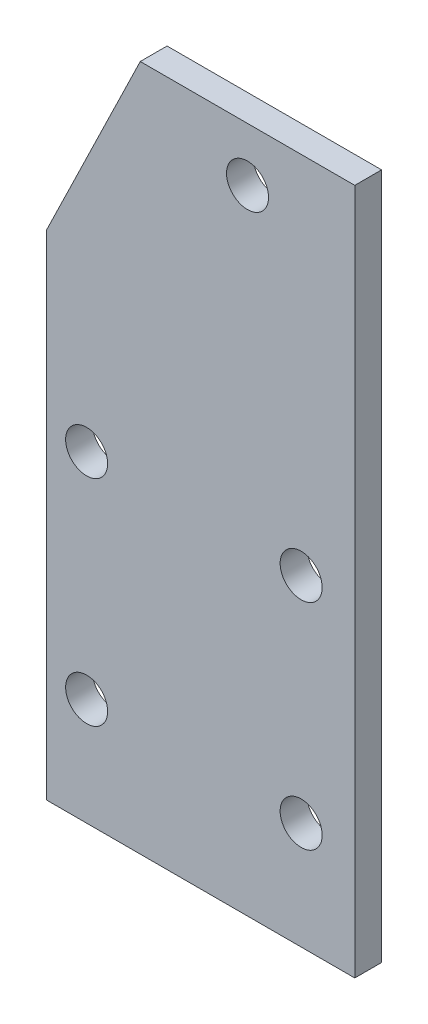
ISO-10303-21;
HEADER;
FILE_DESCRIPTION(('STEP AP214'),'2;1');
FILE_NAME('part.step','',(''),(''),'','','');
FILE_SCHEMA(('AUTOMOTIVE_DESIGN { 1 0 10303 214 1 1 1 1 }'));
ENDSEC;
DATA;
#1=APPLICATION_CONTEXT('core data for automotive mechanical design processes');
#2=APPLICATION_PROTOCOL_DEFINITION('international standard','automotive_design',2000,#1);
#3=PRODUCT_CONTEXT('',#1,'mechanical');
#4=PRODUCT('Part','Part','',(#3));
#5=PRODUCT_RELATED_PRODUCT_CATEGORY('part','',(#4));
#6=PRODUCT_DEFINITION_FORMATION('','',#4);
#7=PRODUCT_DEFINITION_CONTEXT('part definition',#1,'design');
#8=PRODUCT_DEFINITION('design','',#6,#7);
#9=PRODUCT_DEFINITION_SHAPE('','',#8);
#10=(LENGTH_UNIT() NAMED_UNIT(*) SI_UNIT(.MILLI.,.METRE.));
#11=(NAMED_UNIT(*) PLANE_ANGLE_UNIT() SI_UNIT($,.RADIAN.));
#12=(NAMED_UNIT(*) SI_UNIT($,.STERADIAN.) SOLID_ANGLE_UNIT());
#13=UNCERTAINTY_MEASURE_WITH_UNIT(LENGTH_MEASURE(1.E-05),#10,'distance_accuracy_value','');
#14=(GEOMETRIC_REPRESENTATION_CONTEXT(3) GLOBAL_UNCERTAINTY_ASSIGNED_CONTEXT((#13)) GLOBAL_UNIT_ASSIGNED_CONTEXT((#10,
#11,#12)) REPRESENTATION_CONTEXT('',''));
#15=CARTESIAN_POINT('',(0.,0.,0.));
#16=DIRECTION('',(0.,0.,1.));
#17=DIRECTION('',(1.,0.,0.));
#18=AXIS2_PLACEMENT_3D('',#15,#16,#17);
#19=CARTESIAN_POINT('',(0.,0.,3.175));
#20=DIRECTION('',(0.,0.,1.));
#21=DIRECTION('',(1.,0.,0.));
#22=AXIS2_PLACEMENT_3D('',#19,#20,#21);
#23=PLANE('',#22);
#24=CARTESIAN_POINT('',(12.7,-12.7,3.175));
#25=DIRECTION('',(0.,0.,1.));
#26=DIRECTION('',(1.,0.,0.));
#27=AXIS2_PLACEMENT_3D('',#24,#25,#26);
#28=CIRCLE('',#27,2.4892);
#29=CARTESIAN_POINT('',(15.1892,-12.7,3.175));
#30=VERTEX_POINT('',#29);
#31=EDGE_CURVE('E203',#30,#30,#28,.T.);
#32=ORIENTED_EDGE('',*,*,#31,.F.);
#33=EDGE_LOOP('',(#32));
#34=FACE_BOUND('',#33,.T.);
#35=CARTESIAN_POINT('',(-12.7,-12.7,3.175));
#36=DIRECTION('',(0.,0.,1.));
#37=DIRECTION('',(1.,0.,0.));
#38=AXIS2_PLACEMENT_3D('',#35,#36,#37);
#39=CIRCLE('',#38,2.4892);
#40=CARTESIAN_POINT('',(-10.2108,-12.7,3.175));
#41=VERTEX_POINT('',#40);
#42=EDGE_CURVE('E219',#41,#41,#39,.T.);
#43=ORIENTED_EDGE('',*,*,#42,.F.);
#44=EDGE_LOOP('',(#43));
#45=FACE_BOUND('',#44,.T.);
#46=DIRECTION('',(-0.437192706872766,-0.899367854138263,0.));
#47=VECTOR('',#46,1.);
#48=CARTESIAN_POINT('',(-6.35000000000001,55.88,3.175));
#49=LINE('',#48,#47);
#50=CARTESIAN_POINT('',(-6.35000000000001,55.88,3.175));
#51=VERTEX_POINT('',#50);
#52=CARTESIAN_POINT('',(-17.4625,33.02,3.175));
#53=VERTEX_POINT('',#52);
#54=EDGE_CURVE('E139',#51,#53,#49,.T.);
#55=ORIENTED_EDGE('',*,*,#54,.T.);
#56=DIRECTION('',(0.,-1.,0.));
#57=VECTOR('',#56,1.);
#58=CARTESIAN_POINT('',(-17.4625,33.02,3.175));
#59=LINE('',#58,#57);
#60=CARTESIAN_POINT('',(-17.4625,-25.4,3.175));
#61=VERTEX_POINT('',#60);
#62=EDGE_CURVE('E96',#53,#61,#59,.T.);
#63=ORIENTED_EDGE('',*,*,#62,.T.);
#64=DIRECTION('',(1.,0.,0.));
#65=VECTOR('',#64,1.);
#66=CARTESIAN_POINT('',(-17.4625,-25.4,3.175));
#67=LINE('',#66,#65);
#68=CARTESIAN_POINT('',(19.05,-25.4,3.175));
#69=VERTEX_POINT('',#68);
#70=EDGE_CURVE('E100',#61,#69,#67,.T.);
#71=ORIENTED_EDGE('',*,*,#70,.T.);
#72=DIRECTION('',(0.,1.,0.));
#73=VECTOR('',#72,1.);
#74=CARTESIAN_POINT('',(19.05,33.02,3.175));
#75=LINE('',#74,#73);
#76=CARTESIAN_POINT('',(19.05,55.88,3.175));
#77=VERTEX_POINT('',#76);
#78=EDGE_CURVE('E104',#69,#77,#75,.T.);
#79=ORIENTED_EDGE('',*,*,#78,.T.);
#80=DIRECTION('',(-1.,0.,0.));
#81=VECTOR('',#80,1.);
#82=CARTESIAN_POINT('',(19.05,55.88,3.175));
#83=LINE('',#82,#81);
#84=EDGE_CURVE('E63',#77,#51,#83,.T.);
#85=ORIENTED_EDGE('',*,*,#84,.T.);
#86=EDGE_LOOP('',(#55,#63,#71,#79,#85));
#87=FACE_BOUND('',#86,.T.);
#88=CARTESIAN_POINT('',(-12.7,12.7,3.175));
#89=DIRECTION('',(0.,0.,1.));
#90=DIRECTION('',(1.,0.,0.));
#91=AXIS2_PLACEMENT_3D('',#88,#89,#90);
#92=CIRCLE('',#91,2.4892);
#93=CARTESIAN_POINT('',(-10.2108,12.7,3.175));
#94=VERTEX_POINT('',#93);
#95=EDGE_CURVE('E130',#94,#94,#92,.T.);
#96=ORIENTED_EDGE('',*,*,#95,.F.);
#97=EDGE_LOOP('',(#96));
#98=FACE_BOUND('',#97,.T.);
#99=CARTESIAN_POINT('',(12.7,12.7,3.175));
#100=DIRECTION('',(0.,0.,1.));
#101=DIRECTION('',(1.,0.,0.));
#102=AXIS2_PLACEMENT_3D('',#99,#100,#101);
#103=CIRCLE('',#102,2.4892);
#104=CARTESIAN_POINT('',(15.1892,12.7,3.175));
#105=VERTEX_POINT('',#104);
#106=EDGE_CURVE('E211',#105,#105,#103,.T.);
#107=ORIENTED_EDGE('',*,*,#106,.F.);
#108=EDGE_LOOP('',(#107));
#109=FACE_BOUND('',#108,.T.);
#110=CARTESIAN_POINT('',(6.34999999999999,49.53,3.175));
#111=DIRECTION('',(0.,0.,1.));
#112=DIRECTION('',(1.,0.,0.));
#113=AXIS2_PLACEMENT_3D('',#110,#111,#112);
#114=CIRCLE('',#113,2.4892);
#115=CARTESIAN_POINT('',(8.83919999999999,49.53,3.175));
#116=VERTEX_POINT('',#115);
#117=EDGE_CURVE('E192',#116,#116,#114,.T.);
#118=ORIENTED_EDGE('',*,*,#117,.F.);
#119=EDGE_LOOP('',(#118));
#120=FACE_BOUND('',#119,.T.);
#121=ADVANCED_FACE('F45',(#34,#45,#87,#98,#109,#120),#23,.T.);
#122=CARTESIAN_POINT('',(0.,0.,0.));
#123=DIRECTION('',(0.,0.,1.));
#124=DIRECTION('',(1.,0.,0.));
#125=AXIS2_PLACEMENT_3D('',#122,#123,#124);
#126=PLANE('',#125);
#127=DIRECTION('',(-0.437192706872766,-0.899367854138263,0.));
#128=VECTOR('',#127,1.);
#129=CARTESIAN_POINT('',(-6.35000000000001,55.88,0.));
#130=LINE('',#129,#128);
#131=CARTESIAN_POINT('',(-6.35000000000001,55.88,0.));
#132=VERTEX_POINT('',#131);
#133=CARTESIAN_POINT('',(-17.4625,33.02,0.));
#134=VERTEX_POINT('',#133);
#135=EDGE_CURVE('E125',#132,#134,#130,.T.);
#136=ORIENTED_EDGE('',*,*,#135,.F.);
#137=DIRECTION('',(-1.,0.,0.));
#138=VECTOR('',#137,1.);
#139=CARTESIAN_POINT('',(19.05,55.88,0.));
#140=LINE('',#139,#138);
#141=CARTESIAN_POINT('',(19.05,55.88,0.));
#142=VERTEX_POINT('',#141);
#143=EDGE_CURVE('E88',#142,#132,#140,.T.);
#144=ORIENTED_EDGE('',*,*,#143,.F.);
#145=DIRECTION('',(0.,1.,0.));
#146=VECTOR('',#145,1.);
#147=CARTESIAN_POINT('',(19.05,33.02,0.));
#148=LINE('',#147,#146);
#149=CARTESIAN_POINT('',(19.05,-25.4,0.));
#150=VERTEX_POINT('',#149);
#151=EDGE_CURVE('E82',#150,#142,#148,.T.);
#152=ORIENTED_EDGE('',*,*,#151,.F.);
#153=DIRECTION('',(1.,0.,0.));
#154=VECTOR('',#153,1.);
#155=CARTESIAN_POINT('',(-17.4625,-25.4,0.));
#156=LINE('',#155,#154);
#157=CARTESIAN_POINT('',(-17.4625,-25.4,0.));
#158=VERTEX_POINT('',#157);
#159=EDGE_CURVE('E113',#158,#150,#156,.T.);
#160=ORIENTED_EDGE('',*,*,#159,.F.);
#161=DIRECTION('',(0.,-1.,0.));
#162=VECTOR('',#161,1.);
#163=CARTESIAN_POINT('',(-17.4625,33.02,0.));
#164=LINE('',#163,#162);
#165=EDGE_CURVE('E129',#134,#158,#164,.T.);
#166=ORIENTED_EDGE('',*,*,#165,.F.);
#167=EDGE_LOOP('',(#136,#144,#152,#160,#166));
#168=FACE_BOUND('',#167,.T.);
#169=CARTESIAN_POINT('',(-12.7,12.7,0.));
#170=DIRECTION('',(0.,0.,1.));
#171=DIRECTION('',(1.,0.,0.));
#172=AXIS2_PLACEMENT_3D('',#169,#170,#171);
#173=CIRCLE('',#172,2.4892);
#174=CARTESIAN_POINT('',(-10.2108,12.7,0.));
#175=VERTEX_POINT('',#174);
#176=EDGE_CURVE('E223',#175,#175,#173,.T.);
#177=ORIENTED_EDGE('',*,*,#176,.T.);
#178=EDGE_LOOP('',(#177));
#179=FACE_BOUND('',#178,.T.);
#180=CARTESIAN_POINT('',(-12.7,-12.7,0.));
#181=DIRECTION('',(0.,0.,1.));
#182=DIRECTION('',(1.,0.,0.));
#183=AXIS2_PLACEMENT_3D('',#180,#181,#182);
#184=CIRCLE('',#183,2.4892);
#185=CARTESIAN_POINT('',(-10.2108,-12.7,0.));
#186=VERTEX_POINT('',#185);
#187=EDGE_CURVE('E215',#186,#186,#184,.T.);
#188=ORIENTED_EDGE('',*,*,#187,.T.);
#189=EDGE_LOOP('',(#188));
#190=FACE_BOUND('',#189,.T.);
#191=CARTESIAN_POINT('',(12.7,12.7,0.));
#192=DIRECTION('',(0.,0.,1.));
#193=DIRECTION('',(1.,0.,0.));
#194=AXIS2_PLACEMENT_3D('',#191,#192,#193);
#195=CIRCLE('',#194,2.4892);
#196=CARTESIAN_POINT('',(15.1892,12.7,0.));
#197=VERTEX_POINT('',#196);
#198=EDGE_CURVE('E207',#197,#197,#195,.T.);
#199=ORIENTED_EDGE('',*,*,#198,.T.);
#200=EDGE_LOOP('',(#199));
#201=FACE_BOUND('',#200,.T.);
#202=CARTESIAN_POINT('',(12.7,-12.7,0.));
#203=DIRECTION('',(0.,0.,1.));
#204=DIRECTION('',(1.,0.,0.));
#205=AXIS2_PLACEMENT_3D('',#202,#203,#204);
#206=CIRCLE('',#205,2.4892);
#207=CARTESIAN_POINT('',(15.1892,-12.7,0.));
#208=VERTEX_POINT('',#207);
#209=EDGE_CURVE('E200',#208,#208,#206,.T.);
#210=ORIENTED_EDGE('',*,*,#209,.T.);
#211=EDGE_LOOP('',(#210));
#212=FACE_BOUND('',#211,.T.);
#213=CARTESIAN_POINT('',(6.34999999999999,49.53,0.));
#214=DIRECTION('',(0.,0.,1.));
#215=DIRECTION('',(1.,0.,0.));
#216=AXIS2_PLACEMENT_3D('',#213,#214,#215);
#217=CIRCLE('',#216,2.4892);
#218=CARTESIAN_POINT('',(8.83919999999999,49.53,0.));
#219=VERTEX_POINT('',#218);
#220=EDGE_CURVE('E195',#219,#219,#217,.T.);
#221=ORIENTED_EDGE('',*,*,#220,.T.);
#222=EDGE_LOOP('',(#221));
#223=FACE_BOUND('',#222,.T.);
#224=ADVANCED_FACE('F146',(#168,#179,#190,#201,#212,#223),#126,.F.);
#225=CARTESIAN_POINT('',(-6.35000000000001,55.88,3.175));
#226=DIRECTION('',(0.899367854138263,-0.437192706872766,0.));
#227=DIRECTION('',(0.437192706872766,0.899367854138263,0.));
#228=AXIS2_PLACEMENT_3D('',#225,#226,#227);
#229=PLANE('',#228);
#230=ORIENTED_EDGE('',*,*,#135,.T.);
#231=DIRECTION('',(0.,0.,-1.));
#232=VECTOR('',#231,1.);
#233=CARTESIAN_POINT('',(-17.4625,33.02,3.175));
#234=LINE('',#233,#232);
#235=EDGE_CURVE('E11',#53,#134,#234,.T.);
#236=ORIENTED_EDGE('',*,*,#235,.F.);
#237=ORIENTED_EDGE('',*,*,#54,.F.);
#238=DIRECTION('',(0.,0.,-1.));
#239=VECTOR('',#238,1.);
#240=CARTESIAN_POINT('',(-6.35000000000001,55.88,3.175));
#241=LINE('',#240,#239);
#242=EDGE_CURVE('E121',#51,#132,#241,.T.);
#243=ORIENTED_EDGE('',*,*,#242,.T.);
#244=EDGE_LOOP('',(#230,#236,#237,#243));
#245=FACE_BOUND('',#244,.T.);
#246=ADVANCED_FACE('F47',(#245),#229,.F.);
#247=CARTESIAN_POINT('',(-17.4625,33.02,3.175));
#248=DIRECTION('',(1.,0.,0.));
#249=DIRECTION('',(0.,1.,0.));
#250=AXIS2_PLACEMENT_3D('',#247,#248,#249);
#251=PLANE('',#250);
#252=ORIENTED_EDGE('',*,*,#165,.T.);
#253=DIRECTION('',(0.,0.,-1.));
#254=VECTOR('',#253,1.);
#255=CARTESIAN_POINT('',(-17.4625,-25.4,3.175));
#256=LINE('',#255,#254);
#257=EDGE_CURVE('E55',#61,#158,#256,.T.);
#258=ORIENTED_EDGE('',*,*,#257,.F.);
#259=ORIENTED_EDGE('',*,*,#62,.F.);
#260=ORIENTED_EDGE('',*,*,#235,.T.);
#261=EDGE_LOOP('',(#252,#258,#259,#260));
#262=FACE_BOUND('',#261,.T.);
#263=ADVANCED_FACE('F291',(#262),#251,.F.);
#264=CARTESIAN_POINT('',(-17.4625,-25.4,3.175));
#265=DIRECTION('',(0.,1.,0.));
#266=DIRECTION('',(-1.,0.,0.));
#267=AXIS2_PLACEMENT_3D('',#264,#265,#266);
#268=PLANE('',#267);
#269=ORIENTED_EDGE('',*,*,#159,.T.);
#270=DIRECTION('',(0.,0.,-1.));
#271=VECTOR('',#270,1.);
#272=CARTESIAN_POINT('',(19.05,-25.4,3.175));
#273=LINE('',#272,#271);
#274=EDGE_CURVE('E110',#69,#150,#273,.T.);
#275=ORIENTED_EDGE('',*,*,#274,.F.);
#276=ORIENTED_EDGE('',*,*,#70,.F.);
#277=ORIENTED_EDGE('',*,*,#257,.T.);
#278=EDGE_LOOP('',(#269,#275,#276,#277));
#279=FACE_BOUND('',#278,.T.);
#280=ADVANCED_FACE('F111',(#279),#268,.F.);
#281=CARTESIAN_POINT('',(19.05,33.02,3.175));
#282=DIRECTION('',(-1.,0.,0.));
#283=DIRECTION('',(0.,0.,1.));
#284=AXIS2_PLACEMENT_3D('',#281,#282,#283);
#285=PLANE('',#284);
#286=ORIENTED_EDGE('',*,*,#151,.T.);
#287=DIRECTION('',(0.,0.,-1.));
#288=VECTOR('',#287,1.);
#289=CARTESIAN_POINT('',(19.05,55.88,3.175));
#290=LINE('',#289,#288);
#291=EDGE_CURVE('E115',#77,#142,#290,.T.);
#292=ORIENTED_EDGE('',*,*,#291,.F.);
#293=ORIENTED_EDGE('',*,*,#78,.F.);
#294=ORIENTED_EDGE('',*,*,#274,.T.);
#295=EDGE_LOOP('',(#286,#292,#293,#294));
#296=FACE_BOUND('',#295,.T.);
#297=ADVANCED_FACE('F117',(#296),#285,.F.);
#298=CARTESIAN_POINT('',(19.05,55.88,3.175));
#299=DIRECTION('',(0.,-1.,0.));
#300=DIRECTION('',(1.,0.,0.));
#301=AXIS2_PLACEMENT_3D('',#298,#299,#300);
#302=PLANE('',#301);
#303=ORIENTED_EDGE('',*,*,#143,.T.);
#304=ORIENTED_EDGE('',*,*,#242,.F.);
#305=ORIENTED_EDGE('',*,*,#84,.F.);
#306=ORIENTED_EDGE('',*,*,#291,.T.);
#307=EDGE_LOOP('',(#303,#304,#305,#306));
#308=FACE_BOUND('',#307,.T.);
#309=ADVANCED_FACE('F151',(#308),#302,.F.);
#310=CARTESIAN_POINT('',(-12.7,12.7,3.175));
#311=DIRECTION('',(0.,0.,-1.));
#312=DIRECTION('',(-1.,0.,0.));
#313=AXIS2_PLACEMENT_3D('',#310,#311,#312);
#314=CYLINDRICAL_SURFACE('',#313,2.4892);
#315=ORIENTED_EDGE('',*,*,#95,.T.);
#316=EDGE_LOOP('',(#315));
#317=FACE_BOUND('',#316,.T.);
#318=ORIENTED_EDGE('',*,*,#176,.F.);
#319=EDGE_LOOP('',(#318));
#320=FACE_BOUND('',#319,.T.);
#321=ADVANCED_FACE('F153',(#317,#320),#314,.F.);
#322=CARTESIAN_POINT('',(-12.7,-12.7,3.175));
#323=DIRECTION('',(0.,0.,-1.));
#324=DIRECTION('',(-1.,0.,0.));
#325=AXIS2_PLACEMENT_3D('',#322,#323,#324);
#326=CYLINDRICAL_SURFACE('',#325,2.4892);
#327=ORIENTED_EDGE('',*,*,#42,.T.);
#328=EDGE_LOOP('',(#327));
#329=FACE_BOUND('',#328,.T.);
#330=ORIENTED_EDGE('',*,*,#187,.F.);
#331=EDGE_LOOP('',(#330));
#332=FACE_BOUND('',#331,.T.);
#333=ADVANCED_FACE('F159',(#329,#332),#326,.F.);
#334=CARTESIAN_POINT('',(12.7,12.7,3.175));
#335=DIRECTION('',(0.,0.,-1.));
#336=DIRECTION('',(-1.,0.,0.));
#337=AXIS2_PLACEMENT_3D('',#334,#335,#336);
#338=CYLINDRICAL_SURFACE('',#337,2.4892);
#339=ORIENTED_EDGE('',*,*,#106,.T.);
#340=EDGE_LOOP('',(#339));
#341=FACE_BOUND('',#340,.T.);
#342=ORIENTED_EDGE('',*,*,#198,.F.);
#343=EDGE_LOOP('',(#342));
#344=FACE_BOUND('',#343,.T.);
#345=ADVANCED_FACE('F175',(#341,#344),#338,.F.);
#346=CARTESIAN_POINT('',(12.7,-12.7,3.175));
#347=DIRECTION('',(0.,0.,-1.));
#348=DIRECTION('',(-1.,0.,0.));
#349=AXIS2_PLACEMENT_3D('',#346,#347,#348);
#350=CYLINDRICAL_SURFACE('',#349,2.4892);
#351=ORIENTED_EDGE('',*,*,#31,.T.);
#352=EDGE_LOOP('',(#351));
#353=FACE_BOUND('',#352,.T.);
#354=ORIENTED_EDGE('',*,*,#209,.F.);
#355=EDGE_LOOP('',(#354));
#356=FACE_BOUND('',#355,.T.);
#357=ADVANCED_FACE('F179',(#353,#356),#350,.F.);
#358=CARTESIAN_POINT('',(6.34999999999999,49.53,3.175));
#359=DIRECTION('',(0.,0.,-1.));
#360=DIRECTION('',(-1.,0.,0.));
#361=AXIS2_PLACEMENT_3D('',#358,#359,#360);
#362=CYLINDRICAL_SURFACE('',#361,2.4892);
#363=ORIENTED_EDGE('',*,*,#117,.T.);
#364=EDGE_LOOP('',(#363));
#365=FACE_BOUND('',#364,.T.);
#366=ORIENTED_EDGE('',*,*,#220,.F.);
#367=EDGE_LOOP('',(#366));
#368=FACE_BOUND('',#367,.T.);
#369=ADVANCED_FACE('F183',(#365,#368),#362,.F.);
#370=CLOSED_SHELL('',(#121,#224,#246,#263,#280,#297,#309,#321,#333,#345,#357,#369));
#371=MANIFOLD_SOLID_BREP('B2',#370);
#372=ADVANCED_BREP_SHAPE_REPRESENTATION('',(#18,#371),#14);
#373=SHAPE_DEFINITION_REPRESENTATION(#9,#372);
ENDSEC;
END-ISO-10303-21;
